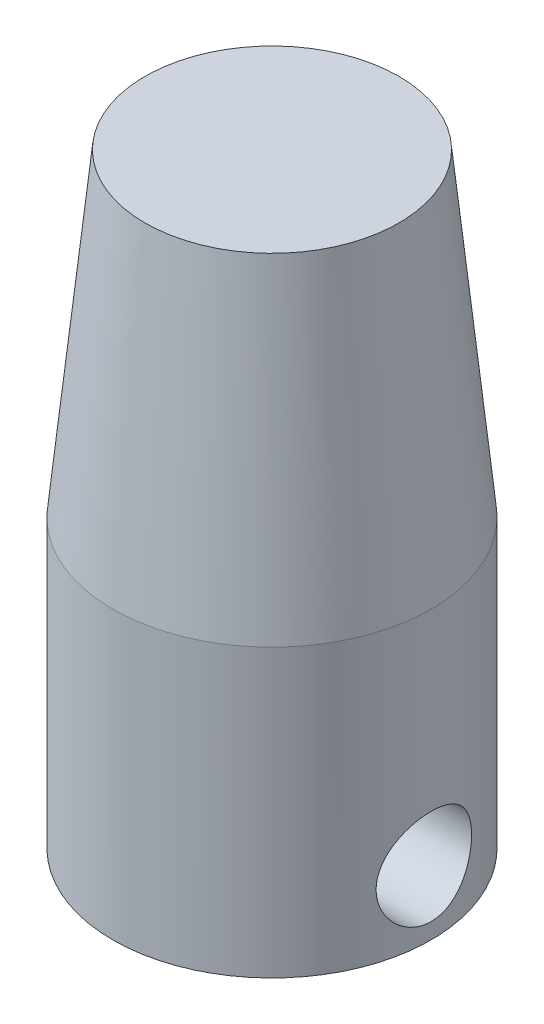
ISO-10303-21;
HEADER;
FILE_DESCRIPTION(('STEP AP214'),'2;1');
FILE_NAME('part.step','',(''),(''),'','','');
FILE_SCHEMA(('AUTOMOTIVE_DESIGN { 1 0 10303 214 1 1 1 1 }'));
ENDSEC;
DATA;
#1=APPLICATION_CONTEXT('core data for automotive mechanical design processes');
#2=APPLICATION_PROTOCOL_DEFINITION('international standard','automotive_design',2000,#1);
#3=PRODUCT_CONTEXT('',#1,'mechanical');
#4=PRODUCT('Part','Part','',(#3));
#5=PRODUCT_RELATED_PRODUCT_CATEGORY('part','',(#4));
#6=PRODUCT_DEFINITION_FORMATION('','',#4);
#7=PRODUCT_DEFINITION_CONTEXT('part definition',#1,'design');
#8=PRODUCT_DEFINITION('design','',#6,#7);
#9=PRODUCT_DEFINITION_SHAPE('','',#8);
#10=(LENGTH_UNIT() NAMED_UNIT(*) SI_UNIT(.MILLI.,.METRE.));
#11=(NAMED_UNIT(*) PLANE_ANGLE_UNIT() SI_UNIT($,.RADIAN.));
#12=(NAMED_UNIT(*) SI_UNIT($,.STERADIAN.) SOLID_ANGLE_UNIT());
#13=UNCERTAINTY_MEASURE_WITH_UNIT(LENGTH_MEASURE(1.E-05),#10,'distance_accuracy_value','');
#14=(GEOMETRIC_REPRESENTATION_CONTEXT(3) GLOBAL_UNCERTAINTY_ASSIGNED_CONTEXT((#13)) GLOBAL_UNIT_ASSIGNED_CONTEXT((#10,
#11,#12)) REPRESENTATION_CONTEXT('',''));
#15=CARTESIAN_POINT('',(0.,0.,0.));
#16=DIRECTION('',(0.,0.,1.));
#17=DIRECTION('',(1.,0.,0.));
#18=AXIS2_PLACEMENT_3D('',#15,#16,#17);
#19=CARTESIAN_POINT('',(0.,9.,0.));
#20=DIRECTION('',(0.,-1.,0.));
#21=DIRECTION('',(0.,0.,-1.));
#22=AXIS2_PLACEMENT_3D('',#19,#20,#21);
#23=CYLINDRICAL_SURFACE('',#22,5.);
#24=CARTESIAN_POINT('',(-5.,0.5,0.));
#25=CARTESIAN_POINT('',(-4.9999992925055,0.500000997484886,-0.0822886127533));
#26=CARTESIAN_POINT('',(-4.99794915693954,0.506793863623966,-0.164587318351529));
#27=CARTESIAN_POINT('',(-4.98997105593691,0.533721354222101,-0.326788125304881));
#28=CARTESIAN_POINT('',(-4.98404193389692,0.553859958023342,-0.40668950441142));
#29=CARTESIAN_POINT('',(-4.96895552501836,0.606746016910264,-0.561732707754527));
#30=CARTESIAN_POINT('',(-4.95980300250425,0.639474869618937,-0.636881364395373));
#31=CARTESIAN_POINT('',(-4.93922109237645,0.716536093055836,-0.780624181053131));
#32=CARTESIAN_POINT('',(-4.92779140192067,0.760870007395417,-0.84921746746967));
#33=CARTESIAN_POINT('',(-4.90350737192774,0.861224007472669,-0.979871797183745));
#34=CARTESIAN_POINT('',(-4.89062383657036,0.917516625885914,-1.04171807124434));
#35=CARTESIAN_POINT('',(-4.86505834210442,1.03960922991018,-1.15524920923324));
#36=CARTESIAN_POINT('',(-4.85237641724501,1.10541081212496,-1.20693236327441));
#37=CARTESIAN_POINT('',(-4.82834113993772,1.24647075303761,-1.29980037723708));
#38=CARTESIAN_POINT('',(-4.81702406663875,1.32190846099074,-1.34072309022213));
#39=CARTESIAN_POINT('',(-4.79743620394031,1.47898925423029,-1.4092139477476));
#40=CARTESIAN_POINT('',(-4.78916468313311,1.56063084392798,-1.43678529919973));
#41=CARTESIAN_POINT('',(-4.77690870838434,1.72539026613046,-1.47701633682652));
#42=CARTESIAN_POINT('',(-4.77281069324533,1.80840274386394,-1.49007196234677));
#43=CARTESIAN_POINT('',(-4.76902789749767,1.97553315621677,-1.50213730614672));
#44=CARTESIAN_POINT('',(-4.76934204760571,2.05965081805909,-1.50115042761078));
#45=CARTESIAN_POINT('',(-4.77424744067778,2.22338390860848,-1.48546977199812));
#46=CARTESIAN_POINT('',(-4.7786838859914,2.30305225036224,-1.47127205262685));
#47=CARTESIAN_POINT('',(-4.79108356228624,2.45881978627346,-1.43037420427056));
#48=CARTESIAN_POINT('',(-4.79904714132351,2.53491862737433,-1.40367284141641));
#49=CARTESIAN_POINT('',(-4.81772733074973,2.68260034966074,-1.33816026653682));
#50=CARTESIAN_POINT('',(-4.82848016115952,2.75410708395526,-1.29918816934642));
#51=CARTESIAN_POINT('',(-4.85150987000065,2.88973202201019,-1.21035222588683));
#52=CARTESIAN_POINT('',(-4.86378711746991,2.95384842941378,-1.16048574002588));
#53=CARTESIAN_POINT('',(-4.88911011297937,3.07568619076202,-1.04881290765546));
#54=CARTESIAN_POINT('',(-4.90216654310498,3.13302866402967,-0.986594907466972));
#55=CARTESIAN_POINT('',(-4.92712244063259,3.23655398406425,-0.853263259313967));
#56=CARTESIAN_POINT('',(-4.9390218351841,3.28273612841443,-0.782149051860888));
#57=CARTESIAN_POINT('',(-4.9604316006947,3.36285992246473,-0.632355038342803));
#58=CARTESIAN_POINT('',(-4.96992543668314,3.39671751624986,-0.55362774974795));
#59=CARTESIAN_POINT('',(-4.98533521832222,3.45059959009963,-0.39124541560352));
#60=CARTESIAN_POINT('',(-4.99125216186999,3.47062792853249,-0.307591751589582));
#61=CARTESIAN_POINT('',(-4.99868364643538,3.49565217789939,-0.140952242668332));
#62=CARTESIAN_POINT('',(-5.0003485041779,3.50116158580161,-0.0580500976011871));
#63=CARTESIAN_POINT('',(-4.9995292324176,3.49843084428792,0.107499605823383));
#64=CARTESIAN_POINT('',(-4.99704565677756,3.49019253034856,0.19014719669078));
#65=CARTESIAN_POINT('',(-4.98830696987163,3.4606153888885,0.350903605309697));
#66=CARTESIAN_POINT('',(-4.98213829799417,3.43957661241913,0.429072772614169));
#67=CARTESIAN_POINT('',(-4.96674347841533,3.3853567672218,0.580754638954522));
#68=CARTESIAN_POINT('',(-4.95751696321085,3.35217423896214,0.654266777025583));
#69=CARTESIAN_POINT('',(-4.93669654351325,3.27374683451887,0.796437189461052));
#70=CARTESIAN_POINT('',(-4.92505280829675,3.22824065905203,0.864943826199669));
#71=CARTESIAN_POINT('',(-4.90073468764318,3.12677524594719,0.993523307980147));
#72=CARTESIAN_POINT('',(-4.8880600443108,3.07081338811233,1.05359403235593));
#73=CARTESIAN_POINT('',(-4.86253171869138,2.94761269163066,1.16585744551027));
#74=CARTESIAN_POINT('',(-4.84968825033268,2.88003812422826,1.21768481231503));
#75=CARTESIAN_POINT('',(-4.82576515238464,2.73687206098647,1.30928995072154));
#76=CARTESIAN_POINT('',(-4.81468547654651,2.66128077544179,1.34906803829472));
#77=CARTESIAN_POINT('',(-4.79567189615055,2.50446750874531,1.41517347127168));
#78=CARTESIAN_POINT('',(-4.78772337843827,2.42327381346341,1.4415634693705));
#79=CARTESIAN_POINT('',(-4.77591594362794,2.25731203106852,1.48021730815114));
#80=CARTESIAN_POINT('',(-4.772055625083,2.17254517921233,1.49248598978779));
#81=CARTESIAN_POINT('',(-4.76899972496087,2.00563848162377,1.50221984485059));
#82=CARTESIAN_POINT('',(-4.76961647442754,1.92353634898242,1.5002805530849));
#83=CARTESIAN_POINT('',(-4.77499401288294,1.7608858966272,1.48307505444813));
#84=CARTESIAN_POINT('',(-4.77975463592551,1.68033751482365,1.46780938124716));
#85=CARTESIAN_POINT('',(-4.79275763670385,1.52405460085715,1.42476888804136));
#86=CARTESIAN_POINT('',(-4.80095604545965,1.44827271263831,1.39715175507068));
#87=CARTESIAN_POINT('',(-4.81990278909136,1.30235756118228,1.33031507121129));
#88=CARTESIAN_POINT('',(-4.83065161194312,1.23222538235924,1.29109329962876));
#89=CARTESIAN_POINT('',(-4.85397676425833,1.09683688347289,1.20048763805072));
#90=CARTESIAN_POINT('',(-4.86660540163798,1.03185123873959,1.14871276092994));
#91=CARTESIAN_POINT('',(-4.89201320450026,0.911297501692137,1.03517434629782));
#92=CARTESIAN_POINT('',(-4.90479240823905,0.855731860532243,0.973408217134502));
#93=CARTESIAN_POINT('',(-4.92950936570649,0.75397658770497,0.839465762183249));
#94=CARTESIAN_POINT('',(-4.94141159765674,0.708108553144511,0.767037885790608));
#95=CARTESIAN_POINT('',(-4.96260680455813,0.629264830095975,0.615141373983529));
#96=CARTESIAN_POINT('',(-4.97190099931067,0.596283111725492,0.535676052998955));
#97=CARTESIAN_POINT('',(-4.98602174969301,0.547104724347251,0.380757712655282));
#98=CARTESIAN_POINT('',(-4.99122027381068,0.529488327116752,0.305786961954234));
#99=CARTESIAN_POINT('',(-4.99820944494492,0.505936474758423,0.15388019523078));
#100=CARTESIAN_POINT('',(-5.0000006615474,0.499999067295181,0.0769445098581397));
#101=CARTESIAN_POINT('',(-5.,0.5,0.));
#102=B_SPLINE_CURVE_WITH_KNOTS('',3,(#24,#25,#26,#27,#28,#29,#30,#31,#32,#33,#34,#35,#36,#37,
#38,#39,#40,#41,#42,#43,#44,#45,#46,#47,#48,#49,#50,#51,#52,#53,#54,#55,#56,#57,#58,#59,#60,#61,
#62,#63,#64,#65,#66,#67,#68,#69,#70,#71,#72,#73,#74,#75,#76,#77,#78,#79,#80,#81,#82,#83,#84,#85,
#86,#87,#88,#89,#90,#91,#92,#93,#94,#95,#96,#97,#98,#99,#100,#101),.UNSPECIFIED.,.T.,.F.,(4,2,2,
2,2,2,2,2,2,2,2,2,2,2,2,2,2,2,2,2,2,2,2,2,2,2,2,2,2,2,2,2,2,2,2,2,2,2,4),(0.,0.246583203612611,
0.493239964846,0.739533676300874,0.985860164412702,1.23855602948191,1.49129437288633,
1.74971481004109,2.00807314543224,2.25919689356599,2.51025978319089,2.75226016697676,
2.99428443658001,3.23962426447119,3.48502360158555,3.74067104048166,3.99633456531071,
4.25371046881688,4.51101453528808,4.75908809438545,5.00712853550327,5.24956746682327,
5.49203554593728,5.74011305702908,5.98825282000191,6.24540400322818,6.5025484425268,
6.75847814951252,7.01432009460283,7.25950155466943,7.504673196616,7.74680040402721,
7.98897397553107,8.23996925679931,8.49102974897502,8.74942996156671,9.00770911595235,
9.23831691930459,9.46888616948874),.UNSPECIFIED.);
#103=CARTESIAN_POINT('',(-5.,0.5,0.));
#104=VERTEX_POINT('',#103);
#105=EDGE_CURVE('E11',#104,#104,#102,.T.);
#106=ORIENTED_EDGE('',*,*,#105,.T.);
#107=EDGE_LOOP('',(#106));
#108=FACE_BOUND('',#107,.T.);
#109=CARTESIAN_POINT('',(4.76969600708473,2.,-1.5));
#110=CARTESIAN_POINT('',(4.7696968572698,1.9178054520576,-1.49999897633764));
#111=CARTESIAN_POINT('',(4.77184390209069,1.83560077585598,-1.49322108167142));
#112=CARTESIAN_POINT('',(4.780165783029,1.67359475040806,-1.46635844446749));
#113=CARTESIAN_POINT('',(4.78634196493468,1.59379421349853,-1.44626925573578));
#114=CARTESIAN_POINT('',(4.80196102485632,1.43896527172827,-1.39352753269955));
#115=CARTESIAN_POINT('',(4.81139846703232,1.36392917036691,-1.36089589394243));
#116=CARTESIAN_POINT('',(4.83246932547567,1.2203780660047,-1.28406421917929));
#117=CARTESIAN_POINT('',(4.84410307041019,1.15186404131556,-1.23986245137053));
#118=CARTESIAN_POINT('',(4.86866862185765,1.02113360942262,-1.13964754141627));
#119=CARTESIAN_POINT('',(4.88162808311636,0.959154102053713,-1.08333207175807));
#120=CARTESIAN_POINT('',(4.90714861936757,0.845362048677491,-0.961136237579599));
#121=CARTESIAN_POINT('',(4.91970964297705,0.793550809550121,-0.895254645461111));
#122=CARTESIAN_POINT('',(4.94333214579389,0.700537300166693,-0.75411143779369));
#123=CARTESIAN_POINT('',(4.95435724342404,0.659576575557191,-0.678684021335815));
#124=CARTESIAN_POINT('',(4.97334435920684,0.591012740957243,-0.521624645369354));
#125=CARTESIAN_POINT('',(4.98130703789495,0.563406750142551,-0.439994028387912));
#126=CARTESIAN_POINT('',(4.99307646003589,0.523119998909491,-0.27532385263083));
#127=CARTESIAN_POINT('',(4.99699557369338,0.510034872347297,-0.192391398953801));
#128=CARTESIAN_POINT('',(5.00063201501348,0.497882675353559,-0.025421823749315));
#129=CARTESIAN_POINT('',(5.00035022521079,0.498812660598037,0.0586150620503682));
#130=CARTESIAN_POINT('',(4.99569603817659,0.514392868543023,0.22257115660016));
#131=CARTESIAN_POINT('',(4.9914542020526,0.528605193809869,0.302536267641341));
#132=CARTESIAN_POINT('',(4.97951522112593,0.56963133599429,0.458889213442527));
#133=CARTESIAN_POINT('',(4.97181785750586,0.596445950942671,0.535276821322846));
#134=CARTESIAN_POINT('',(4.95365220986963,0.662212023418558,0.683347326351281));
#135=CARTESIAN_POINT('',(4.94315269676706,0.701301202807267,0.754965064694478));
#136=CARTESIAN_POINT('',(4.92049640648069,0.790397852428228,0.890764673783156));
#137=CARTESIAN_POINT('',(4.90833923637778,0.840407912963484,0.954944774872131));
#138=CARTESIAN_POINT('',(4.88311550488165,0.952197750751597,1.0766604815298));
#139=CARTESIAN_POINT('',(4.87003195321461,1.01435691902974,1.13384458040111));
#140=CARTESIAN_POINT('',(4.84483979887497,1.14751001789005,1.23707651539824));
#141=CARTESIAN_POINT('',(4.8327312931702,1.21850482538923,1.28312324482853));
#142=CARTESIAN_POINT('',(4.81077903197678,1.36823946924899,1.3631399533545));
#143=CARTESIAN_POINT('',(4.80095810695957,1.44704704586292,1.39698989237679));
#144=CARTESIAN_POINT('',(4.78496392548436,1.60960720844554,1.45083362878413));
#145=CARTESIAN_POINT('',(4.7787894791583,1.69335817153456,1.4708319464056));
#146=CARTESIAN_POINT('',(4.77104849541241,1.86008236073928,1.49574770282165));
#147=CARTESIAN_POINT('',(4.7693187867044,1.94296822389398,1.50119946380212));
#148=CARTESIAN_POINT('',(4.77021192441924,2.10847290000987,1.49835947233062));
#149=CARTESIAN_POINT('',(4.77283416156589,2.19109174873085,1.4900696437133));
#150=CARTESIAN_POINT('',(4.78197558554912,2.35148837797087,1.4604576357419));
#151=CARTESIAN_POINT('',(4.78839176507489,2.42933616426352,1.4394796143128));
#152=CARTESIAN_POINT('',(4.80429141231227,2.58040169081492,1.3854857774794));
#153=CARTESIAN_POINT('',(4.81377535359073,2.65361871414057,1.3524681034276));
#154=CARTESIAN_POINT('',(4.83505835023047,2.79551746407213,1.274318711965));
#155=CARTESIAN_POINT('',(4.84691271069799,2.86402472098579,1.22888564172729));
#156=CARTESIAN_POINT('',(4.87148205646987,2.9926381061808,1.12755301600385));
#157=CARTESIAN_POINT('',(4.88419724730003,3.05274221761279,1.07165095534897));
#158=CARTESIAN_POINT('',(4.90963633548158,3.16518040581474,0.948455132493599));
#159=CARTESIAN_POINT('',(4.92234245063004,3.21713562898698,0.880811065857434));
#160=CARTESIAN_POINT('',(4.94584851748651,3.30896670102775,0.737461784590249));
#161=CARTESIAN_POINT('',(4.95664856384717,3.34884314978146,0.661756970543944));
#162=CARTESIAN_POINT('',(4.97505970474957,3.4150000305683,0.504935504705222));
#163=CARTESIAN_POINT('',(4.98269453424966,3.44138201615898,0.423864622037839));
#164=CARTESIAN_POINT('',(4.99401979596827,3.48006091889042,0.258169966504588));
#165=CARTESIAN_POINT('',(4.9977113567088,3.49236186594842,0.173547217354763));
#166=CARTESIAN_POINT('',(5.00066544081399,3.5022230440545,0.00665215388274265));
#167=CARTESIAN_POINT('',(5.00009305111322,3.50033269540783,-0.0755851790862068));
#168=CARTESIAN_POINT('',(4.99497264465037,3.48317836750088,-0.238519481164404));
#169=CARTESIAN_POINT('',(4.99042485330462,3.46791514651956,-0.319216537346529));
#170=CARTESIAN_POINT('',(4.97791168358327,3.42478833860038,-0.475935813041358));
#171=CARTESIAN_POINT('',(4.96998352900866,3.39706181935099,-0.551998927351392));
#172=CARTESIAN_POINT('',(4.9515294303945,3.32991808549281,-0.698433237752053));
#173=CARTESIAN_POINT('',(4.94100305949946,3.29049894971381,-0.76880349605058));
#174=CARTESIAN_POINT('',(4.91803965828228,3.19962654256996,-0.904301892420563));
#175=CARTESIAN_POINT('',(4.90555226923559,3.14782856999923,-0.969190250076767));
#176=CARTESIAN_POINT('',(4.88023537212334,3.0342896116672,-1.08953757134594));
#177=CARTESIAN_POINT('',(4.86740576641079,2.97254576210185,-1.14499380960194));
#178=CARTESIAN_POINT('',(4.84240680631319,2.83865922168949,-1.24656269394549));
#179=CARTESIAN_POINT('',(4.83026852693485,2.76626144660956,-1.29234759757956));
#180=CARTESIAN_POINT('',(4.80852547508793,2.61444482583898,-1.37104313528776));
#181=CARTESIAN_POINT('',(4.79891948596956,2.53502937639881,-1.40395995557289));
#182=CARTESIAN_POINT('',(4.78427816717594,2.38025956839373,-1.4530194253295));
#183=CARTESIAN_POINT('',(4.7788615484052,2.30539135306901,-1.47058859011232));
#184=CARTESIAN_POINT('',(4.77157042597167,2.15368477750423,-1.49407818835144));
#185=CARTESIAN_POINT('',(4.7696952122143,2.07684681535475,-1.50000095706095));
#186=CARTESIAN_POINT('',(4.76969600708473,2.,-1.5));
#187=B_SPLINE_CURVE_WITH_KNOTS('',3,(#109,#110,#111,#112,#113,#114,#115,#116,#117,#118,#119,
#120,#121,#122,#123,#124,#125,#126,#127,#128,#129,#130,#131,#132,#133,#134,#135,#136,#137,#138,
#139,#140,#141,#142,#143,#144,#145,#146,#147,#148,#149,#150,#151,#152,#153,#154,#155,#156,#157,
#158,#159,#160,#161,#162,#163,#164,#165,#166,#167,#168,#169,#170,#171,#172,#173,#174,#175,#176,
#177,#178,#179,#180,#181,#182,#183,#184,#185,#186),.UNSPECIFIED.,.T.,.F.,(4,2,2,2,2,2,2,2,2,2,2,
2,2,2,2,2,2,2,2,2,2,2,2,2,2,2,2,2,2,2,2,2,2,2,2,2,2,2,4),(0.,0.246300165915542,0.492682641689,
0.738656414466193,0.984667025370101,1.23773150007984,1.49082847871273,1.74915939273645,
2.00743455587877,2.25832140149558,2.5091555410144,2.7520012599088,2.99486235890376,
3.24055209335676,3.4863001659083,3.74152147023278,3.99676812491863,4.25446238246266,
4.51207250628411,4.76008080790309,5.00805439107388,5.24958594938817,5.49115481045787,
5.73920731809388,5.98731925928923,6.24479506100602,6.50225807324202,6.75775391814325,
7.01317662321682,7.2587630391122,7.50433553047755,7.74727096872219,7.99024634491378,
8.24099627054488,8.4918185262989,8.75011639669147,9.00828993963944,9.23861153857447,
9.4688869503356),.UNSPECIFIED.);
#188=CARTESIAN_POINT('',(4.76969600708473,2.,-1.5));
#189=VERTEX_POINT('',#188);
#190=EDGE_CURVE('E41',#189,#189,#187,.T.);
#191=ORIENTED_EDGE('',*,*,#190,.T.);
#192=EDGE_LOOP('',(#191));
#193=FACE_BOUND('',#192,.T.);
#194=CARTESIAN_POINT('',(0.,9.,0.));
#195=DIRECTION('',(0.,-1.,0.));
#196=DIRECTION('',(0.,0.,-1.));
#197=AXIS2_PLACEMENT_3D('',#194,#195,#196);
#198=CIRCLE('',#197,5.);
#199=CARTESIAN_POINT('',(0.,9.,-5.));
#200=VERTEX_POINT('',#199);
#201=EDGE_CURVE('E46',#200,#200,#198,.F.);
#202=ORIENTED_EDGE('',*,*,#201,.F.);
#203=EDGE_LOOP('',(#202));
#204=FACE_BOUND('',#203,.T.);
#205=CARTESIAN_POINT('',(0.,0.,0.));
#206=DIRECTION('',(0.,1.,0.));
#207=DIRECTION('',(0.,0.,1.));
#208=AXIS2_PLACEMENT_3D('',#205,#206,#207);
#209=CIRCLE('',#208,5.);
#210=CARTESIAN_POINT('',(0.,0.,5.));
#211=VERTEX_POINT('',#210);
#212=EDGE_CURVE('E72',#211,#211,#209,.T.);
#213=ORIENTED_EDGE('',*,*,#212,.T.);
#214=EDGE_LOOP('',(#213));
#215=FACE_BOUND('',#214,.T.);
#216=ADVANCED_FACE('F33',(#108,#193,#204,#215),#23,.T.);
#217=CARTESIAN_POINT('',(0.,0.,0.));
#218=DIRECTION('',(0.,1.,0.));
#219=DIRECTION('',(0.,0.,1.));
#220=AXIS2_PLACEMENT_3D('',#217,#218,#219);
#221=PLANE('',#220);
#222=ORIENTED_EDGE('',*,*,#212,.F.);
#223=EDGE_LOOP('',(#222));
#224=FACE_BOUND('',#223,.T.);
#225=ADVANCED_FACE('F59',(#224),#221,.F.);
#226=CARTESIAN_POINT('',(-5.,2.,0.));
#227=DIRECTION('',(1.,0.,0.));
#228=DIRECTION('',(0.,0.,-1.));
#229=AXIS2_PLACEMENT_3D('',#226,#227,#228);
#230=CYLINDRICAL_SURFACE('',#229,1.5);
#231=ORIENTED_EDGE('',*,*,#190,.F.);
#232=EDGE_LOOP('',(#231));
#233=FACE_BOUND('',#232,.T.);
#234=ORIENTED_EDGE('',*,*,#105,.F.);
#235=EDGE_LOOP('',(#234));
#236=FACE_BOUND('',#235,.T.);
#237=ADVANCED_FACE('F54',(#233,#236),#230,.F.);
#238=CARTESIAN_POINT('',(0.,19.,0.));
#239=DIRECTION('',(0.,1.,0.));
#240=DIRECTION('',(0.,0.,1.));
#241=AXIS2_PLACEMENT_3D('',#238,#239,#240);
#242=PLANE('',#241);
#243=CARTESIAN_POINT('',(0.,19.,0.));
#244=DIRECTION('',(0.,1.,0.));
#245=DIRECTION('',(0.,0.,1.));
#246=AXIS2_PLACEMENT_3D('',#243,#244,#245);
#247=CIRCLE('',#246,3.989);
#248=CARTESIAN_POINT('',(0.,19.,3.989));
#249=VERTEX_POINT('',#248);
#250=EDGE_CURVE('E74',#249,#249,#247,.T.);
#251=ORIENTED_EDGE('',*,*,#250,.T.);
#252=EDGE_LOOP('',(#251));
#253=FACE_BOUND('',#252,.T.);
#254=ADVANCED_FACE('F58',(#253),#242,.T.);
#255=CARTESIAN_POINT('',(0.,19.,0.));
#256=DIRECTION('',(0.,-1.,0.));
#257=DIRECTION('',(0.,0.,-1.));
#258=AXIS2_PLACEMENT_3D('',#255,#256,#257);
#259=CONICAL_SURFACE('',#258,3.989,0.100757642368671);
#260=ORIENTED_EDGE('',*,*,#250,.F.);
#261=EDGE_LOOP('',(#260));
#262=FACE_BOUND('',#261,.T.);
#263=ORIENTED_EDGE('',*,*,#201,.T.);
#264=EDGE_LOOP('',(#263));
#265=FACE_BOUND('',#264,.T.);
#266=ADVANCED_FACE('F61',(#262,#265),#259,.T.);
#267=CLOSED_SHELL('',(#216,#225,#237,#254,#266));
#268=MANIFOLD_SOLID_BREP('B2',#267);
#269=ADVANCED_BREP_SHAPE_REPRESENTATION('',(#18,#268),#14);
#270=SHAPE_DEFINITION_REPRESENTATION(#9,#269);
ENDSEC;
END-ISO-10303-21;
